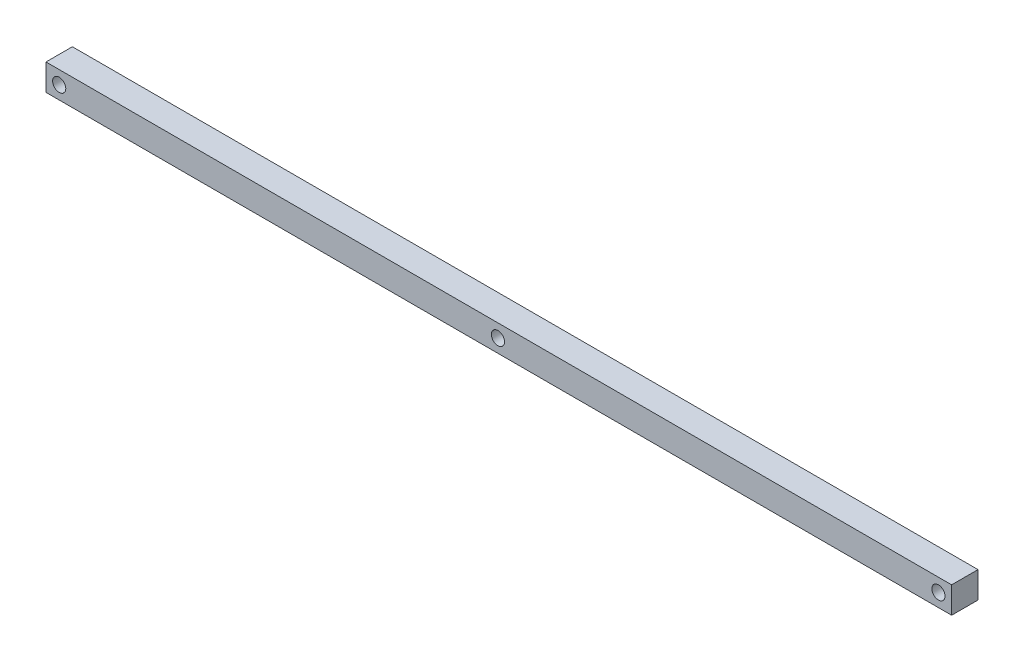
ISO-10303-21;
HEADER;
FILE_DESCRIPTION(('STEP AP214'),'2;1');
FILE_NAME('part.step','',(''),(''),'','','');
FILE_SCHEMA(('AUTOMOTIVE_DESIGN { 1 0 10303 214 1 1 1 1 }'));
ENDSEC;
DATA;
#1=APPLICATION_CONTEXT('core data for automotive mechanical design processes');
#2=APPLICATION_PROTOCOL_DEFINITION('international standard','automotive_design',2000,#1);
#3=PRODUCT_CONTEXT('',#1,'mechanical');
#4=PRODUCT('Part','Part','',(#3));
#5=PRODUCT_RELATED_PRODUCT_CATEGORY('part','',(#4));
#6=PRODUCT_DEFINITION_FORMATION('','',#4);
#7=PRODUCT_DEFINITION_CONTEXT('part definition',#1,'design');
#8=PRODUCT_DEFINITION('design','',#6,#7);
#9=PRODUCT_DEFINITION_SHAPE('','',#8);
#10=(LENGTH_UNIT() NAMED_UNIT(*) SI_UNIT(.MILLI.,.METRE.));
#11=(NAMED_UNIT(*) PLANE_ANGLE_UNIT() SI_UNIT($,.RADIAN.));
#12=(NAMED_UNIT(*) SI_UNIT($,.STERADIAN.) SOLID_ANGLE_UNIT());
#13=UNCERTAINTY_MEASURE_WITH_UNIT(LENGTH_MEASURE(1.E-05),#10,'distance_accuracy_value','');
#14=(GEOMETRIC_REPRESENTATION_CONTEXT(3) GLOBAL_UNCERTAINTY_ASSIGNED_CONTEXT((#13)) GLOBAL_UNIT_ASSIGNED_CONTEXT((#10,
#11,#12)) REPRESENTATION_CONTEXT('',''));
#15=CARTESIAN_POINT('',(0.,0.,0.));
#16=DIRECTION('',(0.,0.,1.));
#17=DIRECTION('',(1.,0.,0.));
#18=AXIS2_PLACEMENT_3D('',#15,#16,#17);
#19=CARTESIAN_POINT('',(0.,0.,15.));
#20=DIRECTION('',(0.,0.,-1.));
#21=DIRECTION('',(-1.,0.,0.));
#22=AXIS2_PLACEMENT_3D('',#19,#20,#21);
#23=PLANE('',#22);
#24=DIRECTION('',(0.,-1.,0.));
#25=VECTOR('',#24,1.);
#26=CARTESIAN_POINT('',(-515.,15.,15.));
#27=LINE('',#26,#25);
#28=CARTESIAN_POINT('',(-515.,15.,15.));
#29=VERTEX_POINT('',#28);
#30=CARTESIAN_POINT('',(-515.,-15.,15.));
#31=VERTEX_POINT('',#30);
#32=EDGE_CURVE('E96',#29,#31,#27,.T.);
#33=ORIENTED_EDGE('',*,*,#32,.T.);
#34=DIRECTION('',(1.,0.,0.));
#35=VECTOR('',#34,1.);
#36=CARTESIAN_POINT('',(515.,-15.,15.));
#37=LINE('',#36,#35);
#38=CARTESIAN_POINT('',(515.,-15.,15.));
#39=VERTEX_POINT('',#38);
#40=EDGE_CURVE('E91',#31,#39,#37,.T.);
#41=ORIENTED_EDGE('',*,*,#40,.T.);
#42=DIRECTION('',(0.,1.,0.));
#43=VECTOR('',#42,1.);
#44=CARTESIAN_POINT('',(515.,15.,15.));
#45=LINE('',#44,#43);
#46=CARTESIAN_POINT('',(515.,15.,15.));
#47=VERTEX_POINT('',#46);
#48=EDGE_CURVE('E94',#39,#47,#45,.T.);
#49=ORIENTED_EDGE('',*,*,#48,.T.);
#50=DIRECTION('',(-1.,0.,0.));
#51=VECTOR('',#50,1.);
#52=CARTESIAN_POINT('',(515.,15.,15.));
#53=LINE('',#52,#51);
#54=EDGE_CURVE('E61',#47,#29,#53,.T.);
#55=ORIENTED_EDGE('',*,*,#54,.T.);
#56=EDGE_LOOP('',(#33,#41,#49,#55));
#57=FACE_BOUND('',#56,.T.);
#58=CARTESIAN_POINT('',(500.,0.,15.));
#59=DIRECTION('',(0.,0.,1.));
#60=DIRECTION('',(1.,0.,0.));
#61=AXIS2_PLACEMENT_3D('',#58,#59,#60);
#62=CIRCLE('',#61,7.50000000000013);
#63=CARTESIAN_POINT('',(507.5,0.,15.));
#64=VERTEX_POINT('',#63);
#65=EDGE_CURVE('E116',#64,#64,#62,.T.);
#66=ORIENTED_EDGE('',*,*,#65,.F.);
#67=EDGE_LOOP('',(#66));
#68=FACE_BOUND('',#67,.T.);
#69=CARTESIAN_POINT('',(-500.,0.,15.));
#70=DIRECTION('',(0.,0.,1.));
#71=DIRECTION('',(1.,0.,0.));
#72=AXIS2_PLACEMENT_3D('',#69,#70,#71);
#73=CIRCLE('',#72,7.50000000000001);
#74=CARTESIAN_POINT('',(-492.5,0.,15.));
#75=VERTEX_POINT('',#74);
#76=EDGE_CURVE('E138',#75,#75,#73,.T.);
#77=ORIENTED_EDGE('',*,*,#76,.F.);
#78=EDGE_LOOP('',(#77));
#79=FACE_BOUND('',#78,.T.);
#80=CARTESIAN_POINT('',(-1.,0.,15.));
#81=DIRECTION('',(0.,0.,1.));
#82=DIRECTION('',(1.,0.,0.));
#83=AXIS2_PLACEMENT_3D('',#80,#81,#82);
#84=CIRCLE('',#83,7.50000000000001);
#85=CARTESIAN_POINT('',(6.50000000000001,0.,15.));
#86=VERTEX_POINT('',#85);
#87=EDGE_CURVE('E146',#86,#86,#84,.T.);
#88=ORIENTED_EDGE('',*,*,#87,.F.);
#89=EDGE_LOOP('',(#88));
#90=FACE_BOUND('',#89,.T.);
#91=ADVANCED_FACE('F43',(#57,#68,#79,#90),#23,.F.);
#92=CARTESIAN_POINT('',(0.,0.,-15.));
#93=DIRECTION('',(0.,0.,-1.));
#94=DIRECTION('',(-1.,0.,0.));
#95=AXIS2_PLACEMENT_3D('',#92,#93,#94);
#96=PLANE('',#95);
#97=CARTESIAN_POINT('',(-500.,0.,-15.));
#98=DIRECTION('',(0.,0.,1.));
#99=DIRECTION('',(1.,0.,0.));
#100=AXIS2_PLACEMENT_3D('',#97,#98,#99);
#101=CIRCLE('',#100,7.50000000000001);
#102=CARTESIAN_POINT('',(-492.5,0.,-15.));
#103=VERTEX_POINT('',#102);
#104=EDGE_CURVE('E142',#103,#103,#101,.T.);
#105=ORIENTED_EDGE('',*,*,#104,.T.);
#106=EDGE_LOOP('',(#105));
#107=FACE_BOUND('',#106,.T.);
#108=DIRECTION('',(0.,-1.,0.));
#109=VECTOR('',#108,1.);
#110=CARTESIAN_POINT('',(-515.,15.,-15.));
#111=LINE('',#110,#109);
#112=CARTESIAN_POINT('',(-515.,15.,-15.));
#113=VERTEX_POINT('',#112);
#114=CARTESIAN_POINT('',(-515.,-15.,-15.));
#115=VERTEX_POINT('',#114);
#116=EDGE_CURVE('E112',#113,#115,#111,.T.);
#117=ORIENTED_EDGE('',*,*,#116,.F.);
#118=DIRECTION('',(-1.,0.,0.));
#119=VECTOR('',#118,1.);
#120=CARTESIAN_POINT('',(515.,15.,-15.));
#121=LINE('',#120,#119);
#122=CARTESIAN_POINT('',(515.,15.,-15.));
#123=VERTEX_POINT('',#122);
#124=EDGE_CURVE('E84',#123,#113,#121,.T.);
#125=ORIENTED_EDGE('',*,*,#124,.F.);
#126=DIRECTION('',(0.,1.,0.));
#127=VECTOR('',#126,1.);
#128=CARTESIAN_POINT('',(515.,15.,-15.));
#129=LINE('',#128,#127);
#130=CARTESIAN_POINT('',(515.,-15.,-15.));
#131=VERTEX_POINT('',#130);
#132=EDGE_CURVE('E78',#131,#123,#129,.T.);
#133=ORIENTED_EDGE('',*,*,#132,.F.);
#134=DIRECTION('',(1.,0.,0.));
#135=VECTOR('',#134,1.);
#136=CARTESIAN_POINT('',(515.,-15.,-15.));
#137=LINE('',#136,#135);
#138=EDGE_CURVE('E101',#115,#131,#137,.T.);
#139=ORIENTED_EDGE('',*,*,#138,.F.);
#140=EDGE_LOOP('',(#117,#125,#133,#139));
#141=FACE_BOUND('',#140,.T.);
#142=CARTESIAN_POINT('',(500.,0.,-15.));
#143=DIRECTION('',(0.,0.,1.));
#144=DIRECTION('',(1.,0.,0.));
#145=AXIS2_PLACEMENT_3D('',#142,#143,#144);
#146=CIRCLE('',#145,7.50000000000013);
#147=CARTESIAN_POINT('',(507.5,0.,-15.));
#148=VERTEX_POINT('',#147);
#149=EDGE_CURVE('E134',#148,#148,#146,.T.);
#150=ORIENTED_EDGE('',*,*,#149,.T.);
#151=EDGE_LOOP('',(#150));
#152=FACE_BOUND('',#151,.T.);
#153=CARTESIAN_POINT('',(-1.,0.,-15.));
#154=DIRECTION('',(0.,0.,1.));
#155=DIRECTION('',(1.,0.,0.));
#156=AXIS2_PLACEMENT_3D('',#153,#154,#155);
#157=CIRCLE('',#156,7.50000000000001);
#158=CARTESIAN_POINT('',(6.50000000000001,0.,-15.));
#159=VERTEX_POINT('',#158);
#160=EDGE_CURVE('E150',#159,#159,#157,.T.);
#161=ORIENTED_EDGE('',*,*,#160,.T.);
#162=EDGE_LOOP('',(#161));
#163=FACE_BOUND('',#162,.T.);
#164=ADVANCED_FACE('F129',(#107,#141,#152,#163),#96,.T.);
#165=CARTESIAN_POINT('',(-515.,15.,15.));
#166=DIRECTION('',(1.,0.,0.));
#167=DIRECTION('',(0.,0.,-1.));
#168=AXIS2_PLACEMENT_3D('',#165,#166,#167);
#169=PLANE('',#168);
#170=ORIENTED_EDGE('',*,*,#116,.T.);
#171=DIRECTION('',(0.,0.,-1.));
#172=VECTOR('',#171,1.);
#173=CARTESIAN_POINT('',(-515.,-15.,15.));
#174=LINE('',#173,#172);
#175=EDGE_CURVE('E11',#31,#115,#174,.T.);
#176=ORIENTED_EDGE('',*,*,#175,.F.);
#177=ORIENTED_EDGE('',*,*,#32,.F.);
#178=DIRECTION('',(0.,0.,-1.));
#179=VECTOR('',#178,1.);
#180=CARTESIAN_POINT('',(-515.,15.,15.));
#181=LINE('',#180,#179);
#182=EDGE_CURVE('E108',#29,#113,#181,.T.);
#183=ORIENTED_EDGE('',*,*,#182,.T.);
#184=EDGE_LOOP('',(#170,#176,#177,#183));
#185=FACE_BOUND('',#184,.T.);
#186=ADVANCED_FACE('F45',(#185),#169,.F.);
#187=CARTESIAN_POINT('',(515.,-15.,15.));
#188=DIRECTION('',(0.,1.,0.));
#189=DIRECTION('',(0.,0.,1.));
#190=AXIS2_PLACEMENT_3D('',#187,#188,#189);
#191=PLANE('',#190);
#192=ORIENTED_EDGE('',*,*,#138,.T.);
#193=DIRECTION('',(0.,0.,-1.));
#194=VECTOR('',#193,1.);
#195=CARTESIAN_POINT('',(515.,-15.,15.));
#196=LINE('',#195,#194);
#197=EDGE_CURVE('E53',#39,#131,#196,.T.);
#198=ORIENTED_EDGE('',*,*,#197,.F.);
#199=ORIENTED_EDGE('',*,*,#40,.F.);
#200=ORIENTED_EDGE('',*,*,#175,.T.);
#201=EDGE_LOOP('',(#192,#198,#199,#200));
#202=FACE_BOUND('',#201,.T.);
#203=ADVANCED_FACE('F100',(#202),#191,.F.);
#204=CARTESIAN_POINT('',(515.,15.,15.));
#205=DIRECTION('',(-1.,0.,0.));
#206=DIRECTION('',(0.,0.,1.));
#207=AXIS2_PLACEMENT_3D('',#204,#205,#206);
#208=PLANE('',#207);
#209=ORIENTED_EDGE('',*,*,#132,.T.);
#210=DIRECTION('',(0.,0.,-1.));
#211=VECTOR('',#210,1.);
#212=CARTESIAN_POINT('',(515.,15.,15.));
#213=LINE('',#212,#211);
#214=EDGE_CURVE('E103',#47,#123,#213,.T.);
#215=ORIENTED_EDGE('',*,*,#214,.F.);
#216=ORIENTED_EDGE('',*,*,#48,.F.);
#217=ORIENTED_EDGE('',*,*,#197,.T.);
#218=EDGE_LOOP('',(#209,#215,#216,#217));
#219=FACE_BOUND('',#218,.T.);
#220=ADVANCED_FACE('F104',(#219),#208,.F.);
#221=CARTESIAN_POINT('',(515.,15.,15.));
#222=DIRECTION('',(0.,-1.,0.));
#223=DIRECTION('',(0.,0.,-1.));
#224=AXIS2_PLACEMENT_3D('',#221,#222,#223);
#225=PLANE('',#224);
#226=ORIENTED_EDGE('',*,*,#124,.T.);
#227=ORIENTED_EDGE('',*,*,#182,.F.);
#228=ORIENTED_EDGE('',*,*,#54,.F.);
#229=ORIENTED_EDGE('',*,*,#214,.T.);
#230=EDGE_LOOP('',(#226,#227,#228,#229));
#231=FACE_BOUND('',#230,.T.);
#232=ADVANCED_FACE('F126',(#231),#225,.F.);
#233=CARTESIAN_POINT('',(500.,0.,15.));
#234=DIRECTION('',(0.,0.,-1.));
#235=DIRECTION('',(-1.,0.,0.));
#236=AXIS2_PLACEMENT_3D('',#233,#234,#235);
#237=CYLINDRICAL_SURFACE('',#236,7.50000000000013);
#238=ORIENTED_EDGE('',*,*,#65,.T.);
#239=EDGE_LOOP('',(#238));
#240=FACE_BOUND('',#239,.T.);
#241=ORIENTED_EDGE('',*,*,#149,.F.);
#242=EDGE_LOOP('',(#241));
#243=FACE_BOUND('',#242,.T.);
#244=ADVANCED_FACE('F169',(#240,#243),#237,.F.);
#245=CARTESIAN_POINT('',(-500.,0.,15.));
#246=DIRECTION('',(0.,0.,-1.));
#247=DIRECTION('',(-1.,0.,0.));
#248=AXIS2_PLACEMENT_3D('',#245,#246,#247);
#249=CYLINDRICAL_SURFACE('',#248,7.50000000000001);
#250=ORIENTED_EDGE('',*,*,#76,.T.);
#251=EDGE_LOOP('',(#250));
#252=FACE_BOUND('',#251,.T.);
#253=ORIENTED_EDGE('',*,*,#104,.F.);
#254=EDGE_LOOP('',(#253));
#255=FACE_BOUND('',#254,.T.);
#256=ADVANCED_FACE('F223',(#252,#255),#249,.F.);
#257=CARTESIAN_POINT('',(-1.,0.,15.));
#258=DIRECTION('',(0.,0.,-1.));
#259=DIRECTION('',(-1.,0.,0.));
#260=AXIS2_PLACEMENT_3D('',#257,#258,#259);
#261=CYLINDRICAL_SURFACE('',#260,7.50000000000001);
#262=ORIENTED_EDGE('',*,*,#87,.T.);
#263=EDGE_LOOP('',(#262));
#264=FACE_BOUND('',#263,.T.);
#265=ORIENTED_EDGE('',*,*,#160,.F.);
#266=EDGE_LOOP('',(#265));
#267=FACE_BOUND('',#266,.T.);
#268=ADVANCED_FACE('F158',(#264,#267),#261,.F.);
#269=CLOSED_SHELL('',(#91,#164,#186,#203,#220,#232,#244,#256,#268));
#270=MANIFOLD_SOLID_BREP('B2',#269);
#271=ADVANCED_BREP_SHAPE_REPRESENTATION('',(#18,#270),#14);
#272=SHAPE_DEFINITION_REPRESENTATION(#9,#271);
ENDSEC;
END-ISO-10303-21;
